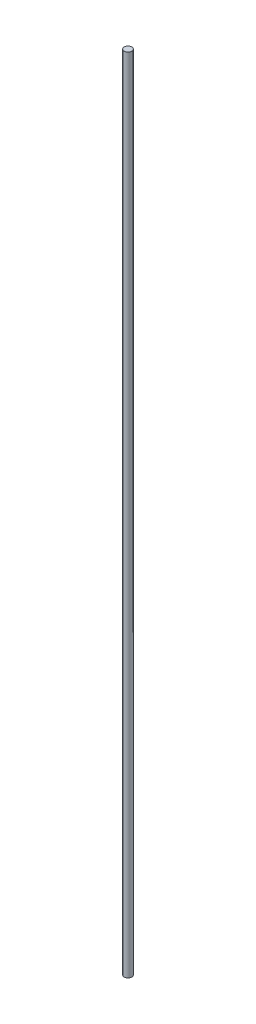
ISO-10303-21;
HEADER;
FILE_DESCRIPTION(('STEP AP214'),'2;1');
FILE_NAME('part.step','',(''),(''),'','','');
FILE_SCHEMA(('AUTOMOTIVE_DESIGN { 1 0 10303 214 1 1 1 1 }'));
ENDSEC;
DATA;
#1=APPLICATION_CONTEXT('core data for automotive mechanical design processes');
#2=APPLICATION_PROTOCOL_DEFINITION('international standard','automotive_design',2000,#1);
#3=PRODUCT_CONTEXT('',#1,'mechanical');
#4=PRODUCT('Part','Part','',(#3));
#5=PRODUCT_RELATED_PRODUCT_CATEGORY('part','',(#4));
#6=PRODUCT_DEFINITION_FORMATION('','',#4);
#7=PRODUCT_DEFINITION_CONTEXT('part definition',#1,'design');
#8=PRODUCT_DEFINITION('design','',#6,#7);
#9=PRODUCT_DEFINITION_SHAPE('','',#8);
#10=(LENGTH_UNIT() NAMED_UNIT(*) SI_UNIT(.MILLI.,.METRE.));
#11=(NAMED_UNIT(*) PLANE_ANGLE_UNIT() SI_UNIT($,.RADIAN.));
#12=(NAMED_UNIT(*) SI_UNIT($,.STERADIAN.) SOLID_ANGLE_UNIT());
#13=UNCERTAINTY_MEASURE_WITH_UNIT(LENGTH_MEASURE(1.E-05),#10,'distance_accuracy_value','');
#14=(GEOMETRIC_REPRESENTATION_CONTEXT(3) GLOBAL_UNCERTAINTY_ASSIGNED_CONTEXT((#13)) GLOBAL_UNIT_ASSIGNED_CONTEXT((#10,
#11,#12)) REPRESENTATION_CONTEXT('',''));
#15=CARTESIAN_POINT('',(0.,0.,0.));
#16=DIRECTION('',(0.,0.,1.));
#17=DIRECTION('',(1.,0.,0.));
#18=AXIS2_PLACEMENT_3D('',#15,#16,#17);
#19=CARTESIAN_POINT('',(0.,2025.,0.));
#20=DIRECTION('',(0.,-1.,0.));
#21=DIRECTION('',(0.,0.,-1.));
#22=AXIS2_PLACEMENT_3D('',#19,#20,#21);
#23=CYLINDRICAL_SURFACE('',#22,9.5);
#24=CARTESIAN_POINT('',(0.,2025.,0.));
#25=DIRECTION('',(0.,1.,0.));
#26=DIRECTION('',(0.,0.,1.));
#27=AXIS2_PLACEMENT_3D('',#24,#25,#26);
#28=CIRCLE('',#27,9.5);
#29=CARTESIAN_POINT('',(0.,2025.,9.5));
#30=VERTEX_POINT('',#29);
#31=EDGE_CURVE('E10',#30,#30,#28,.T.);
#32=ORIENTED_EDGE('',*,*,#31,.F.);
#33=EDGE_LOOP('',(#32));
#34=FACE_BOUND('',#33,.T.);
#35=CARTESIAN_POINT('',(0.,0.,0.));
#36=DIRECTION('',(0.,1.,0.));
#37=DIRECTION('',(0.,0.,1.));
#38=AXIS2_PLACEMENT_3D('',#35,#36,#37);
#39=CIRCLE('',#38,9.5);
#40=CARTESIAN_POINT('',(0.,0.,9.5));
#41=VERTEX_POINT('',#40);
#42=EDGE_CURVE('E40',#41,#41,#39,.T.);
#43=ORIENTED_EDGE('',*,*,#42,.T.);
#44=EDGE_LOOP('',(#43));
#45=FACE_BOUND('',#44,.T.);
#46=ADVANCED_FACE('F37',(#34,#45),#23,.T.);
#47=CARTESIAN_POINT('',(0.,2025.,0.));
#48=DIRECTION('',(0.,1.,0.));
#49=DIRECTION('',(0.,0.,1.));
#50=AXIS2_PLACEMENT_3D('',#47,#48,#49);
#51=PLANE('',#50);
#52=ORIENTED_EDGE('',*,*,#31,.T.);
#53=EDGE_LOOP('',(#52));
#54=FACE_BOUND('',#53,.T.);
#55=ADVANCED_FACE('F54',(#54),#51,.T.);
#56=CARTESIAN_POINT('',(0.,0.,0.));
#57=DIRECTION('',(0.,1.,0.));
#58=DIRECTION('',(0.,0.,1.));
#59=AXIS2_PLACEMENT_3D('',#56,#57,#58);
#60=PLANE('',#59);
#61=ORIENTED_EDGE('',*,*,#42,.F.);
#62=EDGE_LOOP('',(#61));
#63=FACE_BOUND('',#62,.T.);
#64=ADVANCED_FACE('F52',(#63),#60,.F.);
#65=CLOSED_SHELL('',(#46,#55,#64));
#66=MANIFOLD_SOLID_BREP('B2',#65);
#67=ADVANCED_BREP_SHAPE_REPRESENTATION('',(#18,#66),#14);
#68=SHAPE_DEFINITION_REPRESENTATION(#9,#67);
ENDSEC;
END-ISO-10303-21;
